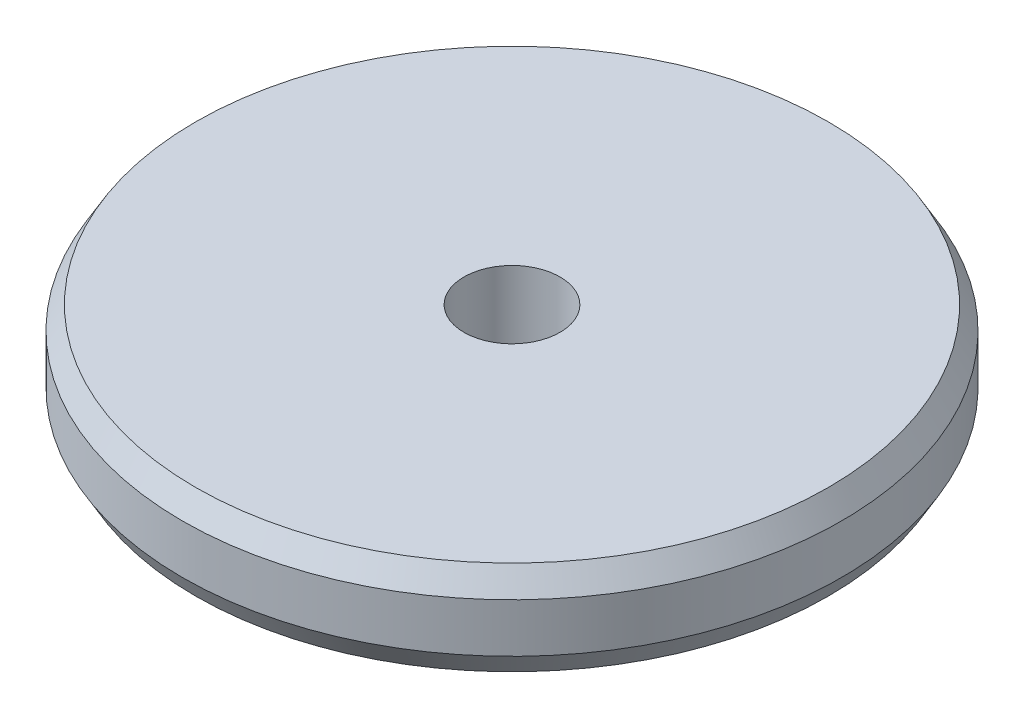
ISO-10303-21;
HEADER;
FILE_DESCRIPTION(('STEP AP214'),'2;1');
FILE_NAME('part.step','',(''),(''),'','','');
FILE_SCHEMA(('AUTOMOTIVE_DESIGN { 1 0 10303 214 1 1 1 1 }'));
ENDSEC;
DATA;
#1=APPLICATION_CONTEXT('core data for automotive mechanical design processes');
#2=APPLICATION_PROTOCOL_DEFINITION('international standard','automotive_design',2000,#1);
#3=PRODUCT_CONTEXT('',#1,'mechanical');
#4=PRODUCT('Part','Part','',(#3));
#5=PRODUCT_RELATED_PRODUCT_CATEGORY('part','',(#4));
#6=PRODUCT_DEFINITION_FORMATION('','',#4);
#7=PRODUCT_DEFINITION_CONTEXT('part definition',#1,'design');
#8=PRODUCT_DEFINITION('design','',#6,#7);
#9=PRODUCT_DEFINITION_SHAPE('','',#8);
#10=(LENGTH_UNIT() NAMED_UNIT(*) SI_UNIT(.MILLI.,.METRE.));
#11=(NAMED_UNIT(*) PLANE_ANGLE_UNIT() SI_UNIT($,.RADIAN.));
#12=(NAMED_UNIT(*) SI_UNIT($,.STERADIAN.) SOLID_ANGLE_UNIT());
#13=UNCERTAINTY_MEASURE_WITH_UNIT(LENGTH_MEASURE(1.E-05),#10,'distance_accuracy_value','');
#14=(GEOMETRIC_REPRESENTATION_CONTEXT(3) GLOBAL_UNCERTAINTY_ASSIGNED_CONTEXT((#13)) GLOBAL_UNIT_ASSIGNED_CONTEXT((#10,
#11,#12)) REPRESENTATION_CONTEXT('',''));
#15=CARTESIAN_POINT('',(0.,0.,0.));
#16=DIRECTION('',(0.,0.,1.));
#17=DIRECTION('',(1.,0.,0.));
#18=AXIS2_PLACEMENT_3D('',#15,#16,#17);
#19=CARTESIAN_POINT('',(0.,5.,0.));
#20=DIRECTION('',(0.,-1.,0.));
#21=DIRECTION('',(0.,0.,-1.));
#22=AXIS2_PLACEMENT_3D('',#19,#20,#21);
#23=CYLINDRICAL_SURFACE('',#22,17.5);
#24=CARTESIAN_POINT('',(0.,3.8,0.));
#25=DIRECTION('',(0.,1.,0.));
#26=DIRECTION('',(0.,0.,1.));
#27=AXIS2_PLACEMENT_3D('',#24,#25,#26);
#28=CIRCLE('',#27,17.5);
#29=CARTESIAN_POINT('',(0.,3.8,17.5));
#30=VERTEX_POINT('',#29);
#31=EDGE_CURVE('E41',#30,#30,#28,.F.);
#32=ORIENTED_EDGE('',*,*,#31,.T.);
#33=EDGE_LOOP('',(#32));
#34=FACE_BOUND('',#33,.T.);
#35=CARTESIAN_POINT('',(0.,1.2,0.));
#36=DIRECTION('',(0.,1.,0.));
#37=DIRECTION('',(0.,0.,1.));
#38=AXIS2_PLACEMENT_3D('',#35,#36,#37);
#39=CIRCLE('',#38,17.5);
#40=CARTESIAN_POINT('',(0.,1.2,17.5));
#41=VERTEX_POINT('',#40);
#42=EDGE_CURVE('E45',#41,#41,#39,.T.);
#43=ORIENTED_EDGE('',*,*,#42,.T.);
#44=EDGE_LOOP('',(#43));
#45=FACE_BOUND('',#44,.T.);
#46=ADVANCED_FACE('F33',(#34,#45),#23,.T.);
#47=CARTESIAN_POINT('',(0.,5.,0.));
#48=DIRECTION('',(0.,1.,0.));
#49=DIRECTION('',(0.,0.,1.));
#50=AXIS2_PLACEMENT_3D('',#47,#48,#49);
#51=PLANE('',#50);
#52=CARTESIAN_POINT('',(0.,5.,0.));
#53=DIRECTION('',(0.,1.,0.));
#54=DIRECTION('',(0.,0.,1.));
#55=AXIS2_PLACEMENT_3D('',#52,#53,#54);
#56=CIRCLE('',#55,16.8071796769725);
#57=CARTESIAN_POINT('',(0.,5.,16.8071796769725));
#58=VERTEX_POINT('',#57);
#59=EDGE_CURVE('E49',#58,#58,#56,.T.);
#60=ORIENTED_EDGE('',*,*,#59,.T.);
#61=EDGE_LOOP('',(#60));
#62=FACE_BOUND('',#61,.T.);
#63=CARTESIAN_POINT('',(0.,5.,0.));
#64=DIRECTION('',(0.,1.,0.));
#65=DIRECTION('',(0.,0.,1.));
#66=AXIS2_PLACEMENT_3D('',#63,#64,#65);
#67=CIRCLE('',#66,2.55);
#68=CARTESIAN_POINT('',(0.,5.,2.55));
#69=VERTEX_POINT('',#68);
#70=EDGE_CURVE('E54',#69,#69,#67,.T.);
#71=ORIENTED_EDGE('',*,*,#70,.F.);
#72=EDGE_LOOP('',(#71));
#73=FACE_BOUND('',#72,.T.);
#74=ADVANCED_FACE('F73',(#62,#73),#51,.T.);
#75=CARTESIAN_POINT('',(0.,0.,0.));
#76=DIRECTION('',(0.,1.,0.));
#77=DIRECTION('',(0.,0.,1.));
#78=AXIS2_PLACEMENT_3D('',#75,#76,#77);
#79=PLANE('',#78);
#80=CARTESIAN_POINT('',(0.,0.,0.));
#81=DIRECTION('',(0.,1.,0.));
#82=DIRECTION('',(0.,0.,1.));
#83=AXIS2_PLACEMENT_3D('',#80,#81,#82);
#84=CIRCLE('',#83,16.8071796769725);
#85=CARTESIAN_POINT('',(0.,0.,16.8071796769725));
#86=VERTEX_POINT('',#85);
#87=EDGE_CURVE('E10',#86,#86,#84,.F.);
#88=ORIENTED_EDGE('',*,*,#87,.T.);
#89=EDGE_LOOP('',(#88));
#90=FACE_BOUND('',#89,.T.);
#91=CARTESIAN_POINT('',(0.,0.,0.));
#92=DIRECTION('',(0.,1.,0.));
#93=DIRECTION('',(0.,0.,1.));
#94=AXIS2_PLACEMENT_3D('',#91,#92,#93);
#95=CIRCLE('',#94,2.55);
#96=CARTESIAN_POINT('',(0.,0.,2.55));
#97=VERTEX_POINT('',#96);
#98=EDGE_CURVE('E57',#97,#97,#95,.T.);
#99=ORIENTED_EDGE('',*,*,#98,.T.);
#100=EDGE_LOOP('',(#99));
#101=FACE_BOUND('',#100,.T.);
#102=ADVANCED_FACE('F61',(#90,#101),#79,.F.);
#103=CARTESIAN_POINT('',(0.,0.,0.));
#104=DIRECTION('',(0.,1.,0.));
#105=DIRECTION('',(0.,0.,1.));
#106=AXIS2_PLACEMENT_3D('',#103,#104,#105);
#107=CYLINDRICAL_SURFACE('',#106,2.55);
#108=ORIENTED_EDGE('',*,*,#70,.T.);
#109=EDGE_LOOP('',(#108));
#110=FACE_BOUND('',#109,.T.);
#111=ORIENTED_EDGE('',*,*,#98,.F.);
#112=EDGE_LOOP('',(#111));
#113=FACE_BOUND('',#112,.T.);
#114=ADVANCED_FACE('F63',(#110,#113),#107,.F.);
#115=CARTESIAN_POINT('',(0.,5.,0.));
#116=DIRECTION('',(0.,-1.,0.));
#117=DIRECTION('',(0.,0.,-1.));
#118=AXIS2_PLACEMENT_3D('',#115,#116,#117);
#119=CONICAL_SURFACE('',#118,16.8071796769725,0.523598775598295);
#120=ORIENTED_EDGE('',*,*,#31,.F.);
#121=EDGE_LOOP('',(#120));
#122=FACE_BOUND('',#121,.T.);
#123=ORIENTED_EDGE('',*,*,#59,.F.);
#124=EDGE_LOOP('',(#123));
#125=FACE_BOUND('',#124,.T.);
#126=ADVANCED_FACE('F65',(#122,#125),#119,.T.);
#127=CARTESIAN_POINT('',(0.,1.2,0.));
#128=DIRECTION('',(0.,1.,0.));
#129=DIRECTION('',(0.,0.,1.));
#130=AXIS2_PLACEMENT_3D('',#127,#128,#129);
#131=CONICAL_SURFACE('',#130,17.5,0.523598775598295);
#132=ORIENTED_EDGE('',*,*,#87,.F.);
#133=EDGE_LOOP('',(#132));
#134=FACE_BOUND('',#133,.T.);
#135=ORIENTED_EDGE('',*,*,#42,.F.);
#136=EDGE_LOOP('',(#135));
#137=FACE_BOUND('',#136,.T.);
#138=ADVANCED_FACE('F36',(#134,#137),#131,.T.);
#139=CLOSED_SHELL('',(#46,#74,#102,#114,#126,#138));
#140=MANIFOLD_SOLID_BREP('B2',#139);
#141=ADVANCED_BREP_SHAPE_REPRESENTATION('',(#18,#140),#14);
#142=SHAPE_DEFINITION_REPRESENTATION(#9,#141);
ENDSEC;
END-ISO-10303-21;
